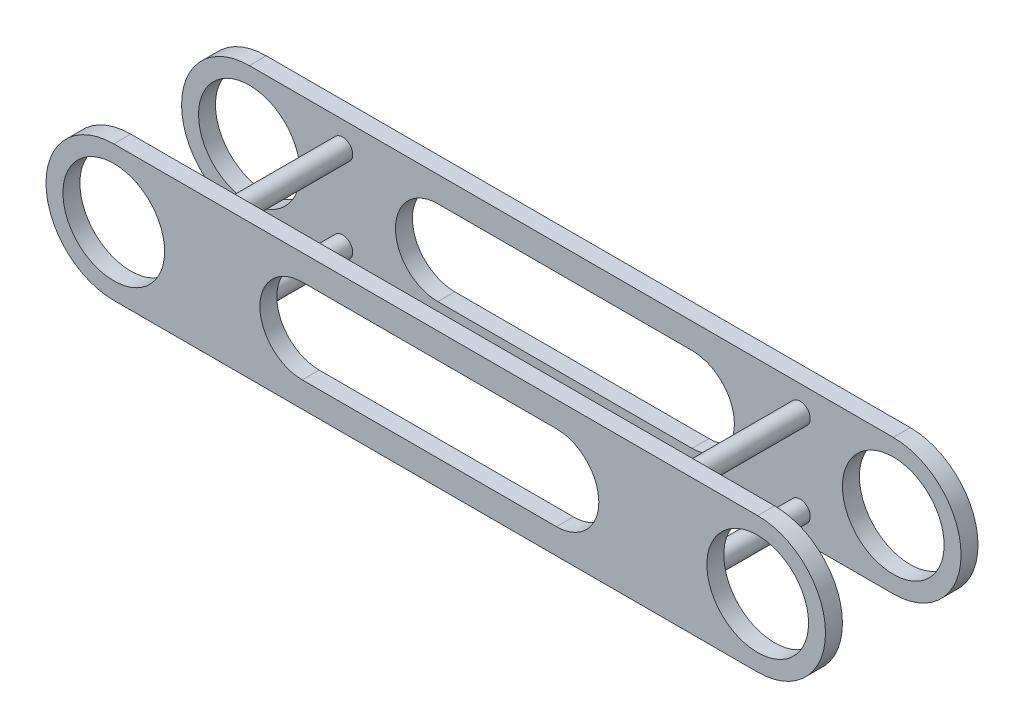
ISO-10303-21;
HEADER;
FILE_DESCRIPTION(('STEP AP214'),'2;1');
FILE_NAME('part.step','',(''),(''),'','','');
FILE_SCHEMA(('AUTOMOTIVE_DESIGN { 1 0 10303 214 1 1 1 1 }'));
ENDSEC;
DATA;
#1=APPLICATION_CONTEXT('core data for automotive mechanical design processes');
#2=APPLICATION_PROTOCOL_DEFINITION('international standard','automotive_design',2000,#1);
#3=PRODUCT_CONTEXT('',#1,'mechanical');
#4=PRODUCT('Part','Part','',(#3));
#5=PRODUCT_RELATED_PRODUCT_CATEGORY('part','',(#4));
#6=PRODUCT_DEFINITION_FORMATION('','',#4);
#7=PRODUCT_DEFINITION_CONTEXT('part definition',#1,'design');
#8=PRODUCT_DEFINITION('design','',#6,#7);
#9=PRODUCT_DEFINITION_SHAPE('','',#8);
#10=(LENGTH_UNIT() NAMED_UNIT(*) SI_UNIT(.MILLI.,.METRE.));
#11=(NAMED_UNIT(*) PLANE_ANGLE_UNIT() SI_UNIT($,.RADIAN.));
#12=(NAMED_UNIT(*) SI_UNIT($,.STERADIAN.) SOLID_ANGLE_UNIT());
#13=UNCERTAINTY_MEASURE_WITH_UNIT(LENGTH_MEASURE(1.E-05),#10,'distance_accuracy_value','');
#14=(GEOMETRIC_REPRESENTATION_CONTEXT(3) GLOBAL_UNCERTAINTY_ASSIGNED_CONTEXT((#13)) GLOBAL_UNIT_ASSIGNED_CONTEXT((#10,
#11,#12)) REPRESENTATION_CONTEXT('',''));
#15=CARTESIAN_POINT('',(0.,0.,0.));
#16=DIRECTION('',(0.,0.,1.));
#17=DIRECTION('',(1.,0.,0.));
#18=AXIS2_PLACEMENT_3D('',#15,#16,#17);
#19=CARTESIAN_POINT('',(380.,0.,-35.));
#20=DIRECTION('',(0.,0.,-1.));
#21=DIRECTION('',(1.,0.,0.));
#22=AXIS2_PLACEMENT_3D('',#19,#20,#21);
#23=PLANE('',#22);
#24=CARTESIAN_POINT('',(55.,25.,-35.));
#25=DIRECTION('',(0.,0.,-1.));
#26=DIRECTION('',(-1.,0.,0.));
#27=AXIS2_PLACEMENT_3D('',#24,#25,#26);
#28=CIRCLE('',#27,6.00000000000007);
#29=CARTESIAN_POINT('',(48.9999999999999,25.,-35.));
#30=VERTEX_POINT('',#29);
#31=EDGE_CURVE('E478',#30,#30,#28,.T.);
#32=ORIENTED_EDGE('',*,*,#31,.T.);
#33=EDGE_LOOP('',(#32));
#34=FACE_BOUND('',#33,.T.);
#35=CARTESIAN_POINT('',(55.,-25.,-35.));
#36=DIRECTION('',(0.,0.,-1.));
#37=DIRECTION('',(-1.,0.,0.));
#38=AXIS2_PLACEMENT_3D('',#35,#36,#37);
#39=CIRCLE('',#38,5.99999999999996);
#40=CARTESIAN_POINT('',(49.,-25.,-35.));
#41=VERTEX_POINT('',#40);
#42=EDGE_CURVE('E472',#41,#41,#39,.T.);
#43=ORIENTED_EDGE('',*,*,#42,.T.);
#44=EDGE_LOOP('',(#43));
#45=FACE_BOUND('',#44,.T.);
#46=CARTESIAN_POINT('',(325.,-25.,-35.));
#47=DIRECTION('',(0.,0.,-1.));
#48=DIRECTION('',(-1.,0.,0.));
#49=AXIS2_PLACEMENT_3D('',#46,#47,#48);
#50=CIRCLE('',#49,5.99999999999999);
#51=CARTESIAN_POINT('',(319.,-25.,-35.));
#52=VERTEX_POINT('',#51);
#53=EDGE_CURVE('E468',#52,#52,#50,.T.);
#54=ORIENTED_EDGE('',*,*,#53,.T.);
#55=EDGE_LOOP('',(#54));
#56=FACE_BOUND('',#55,.T.);
#57=CARTESIAN_POINT('',(325.,25.,-35.));
#58=DIRECTION('',(0.,0.,-1.));
#59=DIRECTION('',(-1.,0.,0.));
#60=AXIS2_PLACEMENT_3D('',#57,#58,#59);
#61=CIRCLE('',#60,5.99999999999999);
#62=CARTESIAN_POINT('',(319.,25.,-35.));
#63=VERTEX_POINT('',#62);
#64=EDGE_CURVE('E464',#63,#63,#61,.T.);
#65=ORIENTED_EDGE('',*,*,#64,.T.);
#66=EDGE_LOOP('',(#65));
#67=FACE_BOUND('',#66,.T.);
#68=CARTESIAN_POINT('',(380.,0.,-35.));
#69=DIRECTION('',(0.,0.,1.));
#70=DIRECTION('',(1.,0.,0.));
#71=AXIS2_PLACEMENT_3D('',#68,#69,#70);
#72=CIRCLE('',#71,40.);
#73=CARTESIAN_POINT('',(380.,-40.,-35.));
#74=VERTEX_POINT('',#73);
#75=CARTESIAN_POINT('',(380.,40.,-35.));
#76=VERTEX_POINT('',#75);
#77=EDGE_CURVE('E206',#74,#76,#72,.T.);
#78=ORIENTED_EDGE('',*,*,#77,.T.);
#79=DIRECTION('',(-1.,0.,0.));
#80=VECTOR('',#79,1.);
#81=CARTESIAN_POINT('',(0.,40.,-35.));
#82=LINE('',#81,#80);
#83=CARTESIAN_POINT('',(0.,40.,-35.));
#84=VERTEX_POINT('',#83);
#85=EDGE_CURVE('E220',#76,#84,#82,.T.);
#86=ORIENTED_EDGE('',*,*,#85,.T.);
#87=CARTESIAN_POINT('',(0.,0.,-35.));
#88=DIRECTION('',(0.,0.,1.));
#89=DIRECTION('',(1.,0.,0.));
#90=AXIS2_PLACEMENT_3D('',#87,#88,#89);
#91=CIRCLE('',#90,40.);
#92=CARTESIAN_POINT('',(0.,-40.,-35.));
#93=VERTEX_POINT('',#92);
#94=EDGE_CURVE('E212',#84,#93,#91,.T.);
#95=ORIENTED_EDGE('',*,*,#94,.T.);
#96=DIRECTION('',(1.,0.,0.));
#97=VECTOR('',#96,1.);
#98=CARTESIAN_POINT('',(0.,-40.,-35.));
#99=LINE('',#98,#97);
#100=EDGE_CURVE('E209',#93,#74,#99,.T.);
#101=ORIENTED_EDGE('',*,*,#100,.T.);
#102=EDGE_LOOP('',(#78,#86,#95,#101));
#103=FACE_BOUND('',#102,.T.);
#104=CARTESIAN_POINT('',(380.,0.,-35.));
#105=DIRECTION('',(0.,0.,-1.));
#106=DIRECTION('',(-1.,0.,0.));
#107=AXIS2_PLACEMENT_3D('',#104,#105,#106);
#108=CIRCLE('',#107,30.);
#109=CARTESIAN_POINT('',(350.,0.,-35.));
#110=VERTEX_POINT('',#109);
#111=EDGE_CURVE('E441',#110,#110,#108,.T.);
#112=ORIENTED_EDGE('',*,*,#111,.T.);
#113=EDGE_LOOP('',(#112));
#114=FACE_BOUND('',#113,.T.);
#115=CARTESIAN_POINT('',(0.,0.,-35.));
#116=DIRECTION('',(0.,0.,-1.));
#117=DIRECTION('',(-1.,0.,0.));
#118=AXIS2_PLACEMENT_3D('',#115,#116,#117);
#119=CIRCLE('',#118,30.);
#120=CARTESIAN_POINT('',(-30.,0.,-35.));
#121=VERTEX_POINT('',#120);
#122=EDGE_CURVE('E429',#121,#121,#119,.T.);
#123=ORIENTED_EDGE('',*,*,#122,.T.);
#124=EDGE_LOOP('',(#123));
#125=FACE_BOUND('',#124,.T.);
#126=CARTESIAN_POINT('',(111.23235506103,0.,-35.));
#127=DIRECTION('',(0.,0.,-1.));
#128=DIRECTION('',(-1.,0.,0.));
#129=AXIS2_PLACEMENT_3D('',#126,#127,#128);
#130=CIRCLE('',#129,25.);
#131=CARTESIAN_POINT('',(111.23235506103,25.,-35.));
#132=VERTEX_POINT('',#131);
#133=CARTESIAN_POINT('',(111.23235506103,-25.,-35.));
#134=VERTEX_POINT('',#133);
#135=EDGE_CURVE('E205',#132,#134,#130,.F.);
#136=ORIENTED_EDGE('',*,*,#135,.F.);
#137=DIRECTION('',(-1.,0.,0.));
#138=VECTOR('',#137,1.);
#139=CARTESIAN_POINT('',(380.,25.,-35.));
#140=LINE('',#139,#138);
#141=CARTESIAN_POINT('',(261.23235506103,25.,-35.));
#142=VERTEX_POINT('',#141);
#143=EDGE_CURVE('E187',#142,#132,#140,.T.);
#144=ORIENTED_EDGE('',*,*,#143,.F.);
#145=CARTESIAN_POINT('',(261.23235506103,0.,-35.));
#146=DIRECTION('',(0.,0.,-1.));
#147=DIRECTION('',(-1.,0.,0.));
#148=AXIS2_PLACEMENT_3D('',#145,#146,#147);
#149=CIRCLE('',#148,25.);
#150=CARTESIAN_POINT('',(261.23235506103,-25.,-35.));
#151=VERTEX_POINT('',#150);
#152=EDGE_CURVE('E167',#151,#142,#149,.F.);
#153=ORIENTED_EDGE('',*,*,#152,.F.);
#154=DIRECTION('',(1.,0.,0.));
#155=VECTOR('',#154,1.);
#156=CARTESIAN_POINT('',(380.,-25.,-35.));
#157=LINE('',#156,#155);
#158=EDGE_CURVE('E200',#134,#151,#157,.T.);
#159=ORIENTED_EDGE('',*,*,#158,.F.);
#160=EDGE_LOOP('',(#136,#144,#153,#159));
#161=FACE_BOUND('',#160,.T.);
#162=ADVANCED_FACE('F44',(#34,#45,#56,#67,#103,#114,#125,#161),#23,.F.);
#163=CARTESIAN_POINT('',(380.,0.,-45.));
#164=DIRECTION('',(0.,0.,-1.));
#165=DIRECTION('',(1.,0.,0.));
#166=AXIS2_PLACEMENT_3D('',#163,#164,#165);
#167=PLANE('',#166);
#168=CARTESIAN_POINT('',(0.,0.,-45.));
#169=DIRECTION('',(0.,0.,-1.));
#170=DIRECTION('',(-1.,0.,0.));
#171=AXIS2_PLACEMENT_3D('',#168,#169,#170);
#172=CIRCLE('',#171,30.);
#173=CARTESIAN_POINT('',(-30.,0.,-45.));
#174=VERTEX_POINT('',#173);
#175=EDGE_CURVE('E424',#174,#174,#172,.T.);
#176=ORIENTED_EDGE('',*,*,#175,.F.);
#177=EDGE_LOOP('',(#176));
#178=FACE_BOUND('',#177,.T.);
#179=CARTESIAN_POINT('',(380.,0.,-45.));
#180=DIRECTION('',(0.,0.,-1.));
#181=DIRECTION('',(-1.,0.,0.));
#182=AXIS2_PLACEMENT_3D('',#179,#180,#181);
#183=CIRCLE('',#182,30.);
#184=CARTESIAN_POINT('',(350.,0.,-45.));
#185=VERTEX_POINT('',#184);
#186=EDGE_CURVE('E439',#185,#185,#183,.T.);
#187=ORIENTED_EDGE('',*,*,#186,.F.);
#188=EDGE_LOOP('',(#187));
#189=FACE_BOUND('',#188,.T.);
#190=CARTESIAN_POINT('',(380.,0.,-45.));
#191=DIRECTION('',(0.,0.,1.));
#192=DIRECTION('',(1.,0.,0.));
#193=AXIS2_PLACEMENT_3D('',#190,#191,#192);
#194=CIRCLE('',#193,40.);
#195=CARTESIAN_POINT('',(380.,-40.,-45.));
#196=VERTEX_POINT('',#195);
#197=CARTESIAN_POINT('',(380.,40.,-45.));
#198=VERTEX_POINT('',#197);
#199=EDGE_CURVE('E202',#196,#198,#194,.T.);
#200=ORIENTED_EDGE('',*,*,#199,.F.);
#201=DIRECTION('',(1.,0.,0.));
#202=VECTOR('',#201,1.);
#203=CARTESIAN_POINT('',(0.,-40.,-45.));
#204=LINE('',#203,#202);
#205=CARTESIAN_POINT('',(0.,-40.,-45.));
#206=VERTEX_POINT('',#205);
#207=EDGE_CURVE('E221',#206,#196,#204,.T.);
#208=ORIENTED_EDGE('',*,*,#207,.F.);
#209=CARTESIAN_POINT('',(0.,0.,-45.));
#210=DIRECTION('',(0.,0.,1.));
#211=DIRECTION('',(1.,0.,0.));
#212=AXIS2_PLACEMENT_3D('',#209,#210,#211);
#213=CIRCLE('',#212,40.);
#214=CARTESIAN_POINT('',(0.,40.,-45.));
#215=VERTEX_POINT('',#214);
#216=EDGE_CURVE('E230',#215,#206,#213,.T.);
#217=ORIENTED_EDGE('',*,*,#216,.F.);
#218=DIRECTION('',(-1.,0.,0.));
#219=VECTOR('',#218,1.);
#220=CARTESIAN_POINT('',(0.,40.,-45.));
#221=LINE('',#220,#219);
#222=EDGE_CURVE('E211',#198,#215,#221,.T.);
#223=ORIENTED_EDGE('',*,*,#222,.F.);
#224=EDGE_LOOP('',(#200,#208,#217,#223));
#225=FACE_BOUND('',#224,.T.);
#226=DIRECTION('',(-1.,0.,0.));
#227=VECTOR('',#226,1.);
#228=CARTESIAN_POINT('',(111.23235506103,25.,-45.));
#229=LINE('',#228,#227);
#230=CARTESIAN_POINT('',(261.23235506103,25.,-45.));
#231=VERTEX_POINT('',#230);
#232=CARTESIAN_POINT('',(111.23235506103,25.,-45.));
#233=VERTEX_POINT('',#232);
#234=EDGE_CURVE('E171',#231,#233,#229,.T.);
#235=ORIENTED_EDGE('',*,*,#234,.T.);
#236=CARTESIAN_POINT('',(111.23235506103,0.,-45.));
#237=DIRECTION('',(0.,0.,1.));
#238=DIRECTION('',(1.,0.,0.));
#239=AXIS2_PLACEMENT_3D('',#236,#237,#238);
#240=CIRCLE('',#239,25.);
#241=CARTESIAN_POINT('',(111.23235506103,-25.,-45.));
#242=VERTEX_POINT('',#241);
#243=EDGE_CURVE('E72',#233,#242,#240,.T.);
#244=ORIENTED_EDGE('',*,*,#243,.T.);
#245=DIRECTION('',(1.,0.,0.));
#246=VECTOR('',#245,1.);
#247=CARTESIAN_POINT('',(111.23235506103,-25.,-45.));
#248=LINE('',#247,#246);
#249=CARTESIAN_POINT('',(261.23235506103,-25.,-45.));
#250=VERTEX_POINT('',#249);
#251=EDGE_CURVE('E179',#242,#250,#248,.T.);
#252=ORIENTED_EDGE('',*,*,#251,.T.);
#253=CARTESIAN_POINT('',(261.23235506103,0.,-45.));
#254=DIRECTION('',(0.,0.,1.));
#255=DIRECTION('',(1.,0.,0.));
#256=AXIS2_PLACEMENT_3D('',#253,#254,#255);
#257=CIRCLE('',#256,25.);
#258=EDGE_CURVE('E162',#250,#231,#257,.T.);
#259=ORIENTED_EDGE('',*,*,#258,.T.);
#260=EDGE_LOOP('',(#235,#244,#252,#259));
#261=FACE_BOUND('',#260,.T.);
#262=ADVANCED_FACE('F178',(#178,#189,#225,#261),#167,.T.);
#263=CARTESIAN_POINT('',(380.,0.,35.));
#264=DIRECTION('',(0.,0.,1.));
#265=DIRECTION('',(1.,0.,0.));
#266=AXIS2_PLACEMENT_3D('',#263,#264,#265);
#267=CYLINDRICAL_SURFACE('',#266,40.);
#268=CARTESIAN_POINT('',(380.,0.,45.));
#269=DIRECTION('',(0.,0.,1.));
#270=DIRECTION('',(1.,0.,0.));
#271=AXIS2_PLACEMENT_3D('',#268,#269,#270);
#272=CIRCLE('',#271,40.);
#273=CARTESIAN_POINT('',(380.,-40.,45.));
#274=VERTEX_POINT('',#273);
#275=CARTESIAN_POINT('',(380.,40.,45.));
#276=VERTEX_POINT('',#275);
#277=EDGE_CURVE('E292',#274,#276,#272,.T.);
#278=ORIENTED_EDGE('',*,*,#277,.F.);
#279=DIRECTION('',(0.,0.,1.));
#280=VECTOR('',#279,1.);
#281=CARTESIAN_POINT('',(380.,-40.,35.));
#282=LINE('',#281,#280);
#283=CARTESIAN_POINT('',(380.,-40.,35.));
#284=VERTEX_POINT('',#283);
#285=EDGE_CURVE('E11',#284,#274,#282,.T.);
#286=ORIENTED_EDGE('',*,*,#285,.F.);
#287=CARTESIAN_POINT('',(380.,0.,35.));
#288=DIRECTION('',(0.,0.,1.));
#289=DIRECTION('',(1.,0.,0.));
#290=AXIS2_PLACEMENT_3D('',#287,#288,#289);
#291=CIRCLE('',#290,40.);
#292=CARTESIAN_POINT('',(380.,40.,35.));
#293=VERTEX_POINT('',#292);
#294=EDGE_CURVE('E295',#284,#293,#291,.T.);
#295=ORIENTED_EDGE('',*,*,#294,.T.);
#296=DIRECTION('',(0.,0.,1.));
#297=VECTOR('',#296,1.);
#298=CARTESIAN_POINT('',(380.,40.,35.));
#299=LINE('',#298,#297);
#300=EDGE_CURVE('E47',#293,#276,#299,.T.);
#301=ORIENTED_EDGE('',*,*,#300,.T.);
#302=EDGE_LOOP('',(#278,#286,#295,#301));
#303=FACE_BOUND('',#302,.T.);
#304=ADVANCED_FACE('F50',(#303),#267,.T.);
#305=CARTESIAN_POINT('',(0.,-40.,35.));
#306=DIRECTION('',(0.,-1.,0.));
#307=DIRECTION('',(1.,0.,0.));
#308=AXIS2_PLACEMENT_3D('',#305,#306,#307);
#309=PLANE('',#308);
#310=DIRECTION('',(1.,0.,0.));
#311=VECTOR('',#310,1.);
#312=CARTESIAN_POINT('',(0.,-40.,45.));
#313=LINE('',#312,#311);
#314=CARTESIAN_POINT('',(0.,-40.,45.));
#315=VERTEX_POINT('',#314);
#316=EDGE_CURVE('E300',#315,#274,#313,.T.);
#317=ORIENTED_EDGE('',*,*,#316,.F.);
#318=DIRECTION('',(0.,0.,1.));
#319=VECTOR('',#318,1.);
#320=CARTESIAN_POINT('',(0.,-40.,35.));
#321=LINE('',#320,#319);
#322=CARTESIAN_POINT('',(0.,-40.,35.));
#323=VERTEX_POINT('',#322);
#324=EDGE_CURVE('E54',#323,#315,#321,.T.);
#325=ORIENTED_EDGE('',*,*,#324,.F.);
#326=DIRECTION('',(1.,0.,0.));
#327=VECTOR('',#326,1.);
#328=CARTESIAN_POINT('',(0.,-40.,35.));
#329=LINE('',#328,#327);
#330=EDGE_CURVE('E304',#323,#284,#329,.T.);
#331=ORIENTED_EDGE('',*,*,#330,.T.);
#332=ORIENTED_EDGE('',*,*,#285,.T.);
#333=EDGE_LOOP('',(#317,#325,#331,#332));
#334=FACE_BOUND('',#333,.T.);
#335=ADVANCED_FACE('F339',(#334),#309,.T.);
#336=CARTESIAN_POINT('',(0.,0.,35.));
#337=DIRECTION('',(0.,0.,1.));
#338=DIRECTION('',(1.,0.,0.));
#339=AXIS2_PLACEMENT_3D('',#336,#337,#338);
#340=CYLINDRICAL_SURFACE('',#339,40.);
#341=CARTESIAN_POINT('',(0.,0.,45.));
#342=DIRECTION('',(0.,0.,1.));
#343=DIRECTION('',(1.,0.,0.));
#344=AXIS2_PLACEMENT_3D('',#341,#342,#343);
#345=CIRCLE('',#344,40.);
#346=CARTESIAN_POINT('',(0.,40.,45.));
#347=VERTEX_POINT('',#346);
#348=EDGE_CURVE('E316',#347,#315,#345,.T.);
#349=ORIENTED_EDGE('',*,*,#348,.F.);
#350=DIRECTION('',(0.,0.,1.));
#351=VECTOR('',#350,1.);
#352=CARTESIAN_POINT('',(0.,40.,35.));
#353=LINE('',#352,#351);
#354=CARTESIAN_POINT('',(0.,40.,35.));
#355=VERTEX_POINT('',#354);
#356=EDGE_CURVE('E322',#355,#347,#353,.T.);
#357=ORIENTED_EDGE('',*,*,#356,.F.);
#358=CARTESIAN_POINT('',(0.,0.,35.));
#359=DIRECTION('',(0.,0.,1.));
#360=DIRECTION('',(1.,0.,0.));
#361=AXIS2_PLACEMENT_3D('',#358,#359,#360);
#362=CIRCLE('',#361,40.);
#363=EDGE_CURVE('E301',#355,#323,#362,.T.);
#364=ORIENTED_EDGE('',*,*,#363,.T.);
#365=ORIENTED_EDGE('',*,*,#324,.T.);
#366=EDGE_LOOP('',(#349,#357,#364,#365));
#367=FACE_BOUND('',#366,.T.);
#368=ADVANCED_FACE('F344',(#367),#340,.T.);
#369=CARTESIAN_POINT('',(0.,40.,35.));
#370=DIRECTION('',(0.,1.,0.));
#371=DIRECTION('',(0.,0.,1.));
#372=AXIS2_PLACEMENT_3D('',#369,#370,#371);
#373=PLANE('',#372);
#374=DIRECTION('',(-1.,0.,0.));
#375=VECTOR('',#374,1.);
#376=CARTESIAN_POINT('',(0.,40.,45.));
#377=LINE('',#376,#375);
#378=EDGE_CURVE('E315',#276,#347,#377,.T.);
#379=ORIENTED_EDGE('',*,*,#378,.F.);
#380=ORIENTED_EDGE('',*,*,#300,.F.);
#381=DIRECTION('',(-1.,0.,0.));
#382=VECTOR('',#381,1.);
#383=CARTESIAN_POINT('',(0.,40.,35.));
#384=LINE('',#383,#382);
#385=EDGE_CURVE('E298',#293,#355,#384,.T.);
#386=ORIENTED_EDGE('',*,*,#385,.T.);
#387=ORIENTED_EDGE('',*,*,#356,.T.);
#388=EDGE_LOOP('',(#379,#380,#386,#387));
#389=FACE_BOUND('',#388,.T.);
#390=ADVANCED_FACE('F331',(#389),#373,.T.);
#391=CARTESIAN_POINT('',(380.,0.,35.));
#392=DIRECTION('',(0.,0.,1.));
#393=DIRECTION('',(1.,0.,0.));
#394=AXIS2_PLACEMENT_3D('',#391,#392,#393);
#395=PLANE('',#394);
#396=CARTESIAN_POINT('',(55.,25.,35.));
#397=DIRECTION('',(0.,0.,1.));
#398=DIRECTION('',(1.,0.,0.));
#399=AXIS2_PLACEMENT_3D('',#396,#397,#398);
#400=CIRCLE('',#399,6.00000000000007);
#401=CARTESIAN_POINT('',(61.,25.,35.));
#402=VERTEX_POINT('',#401);
#403=EDGE_CURVE('E446',#402,#402,#400,.F.);
#404=ORIENTED_EDGE('',*,*,#403,.F.);
#405=EDGE_LOOP('',(#404));
#406=FACE_BOUND('',#405,.T.);
#407=CARTESIAN_POINT('',(55.,-25.,35.));
#408=DIRECTION('',(0.,0.,1.));
#409=DIRECTION('',(1.,0.,0.));
#410=AXIS2_PLACEMENT_3D('',#407,#408,#409);
#411=CIRCLE('',#410,5.99999999999996);
#412=CARTESIAN_POINT('',(60.9999999999999,-25.,35.));
#413=VERTEX_POINT('',#412);
#414=EDGE_CURVE('E452',#413,#413,#411,.F.);
#415=ORIENTED_EDGE('',*,*,#414,.F.);
#416=EDGE_LOOP('',(#415));
#417=FACE_BOUND('',#416,.T.);
#418=CARTESIAN_POINT('',(325.,-25.,35.));
#419=DIRECTION('',(0.,0.,1.));
#420=DIRECTION('',(1.,0.,0.));
#421=AXIS2_PLACEMENT_3D('',#418,#419,#420);
#422=CIRCLE('',#421,5.99999999999999);
#423=CARTESIAN_POINT('',(331.,-25.,35.));
#424=VERTEX_POINT('',#423);
#425=EDGE_CURVE('E449',#424,#424,#422,.F.);
#426=ORIENTED_EDGE('',*,*,#425,.F.);
#427=EDGE_LOOP('',(#426));
#428=FACE_BOUND('',#427,.T.);
#429=CARTESIAN_POINT('',(325.,25.,35.));
#430=DIRECTION('',(0.,0.,1.));
#431=DIRECTION('',(1.,0.,0.));
#432=AXIS2_PLACEMENT_3D('',#429,#430,#431);
#433=CIRCLE('',#432,5.99999999999999);
#434=CARTESIAN_POINT('',(331.,25.,35.));
#435=VERTEX_POINT('',#434);
#436=EDGE_CURVE('E453',#435,#435,#433,.F.);
#437=ORIENTED_EDGE('',*,*,#436,.F.);
#438=EDGE_LOOP('',(#437));
#439=FACE_BOUND('',#438,.T.);
#440=CARTESIAN_POINT('',(380.,0.,35.));
#441=DIRECTION('',(0.,0.,1.));
#442=DIRECTION('',(1.,0.,0.));
#443=AXIS2_PLACEMENT_3D('',#440,#441,#442);
#444=CIRCLE('',#443,30.);
#445=CARTESIAN_POINT('',(410.,0.,35.));
#446=VERTEX_POINT('',#445);
#447=EDGE_CURVE('E436',#446,#446,#444,.T.);
#448=ORIENTED_EDGE('',*,*,#447,.T.);
#449=EDGE_LOOP('',(#448));
#450=FACE_BOUND('',#449,.T.);
#451=DIRECTION('',(-1.,0.,0.));
#452=VECTOR('',#451,1.);
#453=CARTESIAN_POINT('',(380.,25.,35.));
#454=LINE('',#453,#452);
#455=CARTESIAN_POINT('',(261.23235506103,25.,35.));
#456=VERTEX_POINT('',#455);
#457=CARTESIAN_POINT('',(111.23235506103,25.,35.));
#458=VERTEX_POINT('',#457);
#459=EDGE_CURVE('E281',#456,#458,#454,.T.);
#460=ORIENTED_EDGE('',*,*,#459,.T.);
#461=CARTESIAN_POINT('',(111.23235506103,0.,35.));
#462=DIRECTION('',(0.,0.,1.));
#463=DIRECTION('',(1.,0.,0.));
#464=AXIS2_PLACEMENT_3D('',#461,#462,#463);
#465=CIRCLE('',#464,25.);
#466=CARTESIAN_POINT('',(111.23235506103,-25.,35.));
#467=VERTEX_POINT('',#466);
#468=EDGE_CURVE('E290',#458,#467,#465,.T.);
#469=ORIENTED_EDGE('',*,*,#468,.T.);
#470=DIRECTION('',(1.,0.,0.));
#471=VECTOR('',#470,1.);
#472=CARTESIAN_POINT('',(380.,-25.,35.));
#473=LINE('',#472,#471);
#474=CARTESIAN_POINT('',(261.23235506103,-25.,35.));
#475=VERTEX_POINT('',#474);
#476=EDGE_CURVE('E266',#467,#475,#473,.T.);
#477=ORIENTED_EDGE('',*,*,#476,.T.);
#478=CARTESIAN_POINT('',(261.23235506103,0.,35.));
#479=DIRECTION('',(0.,0.,1.));
#480=DIRECTION('',(1.,0.,0.));
#481=AXIS2_PLACEMENT_3D('',#478,#479,#480);
#482=CIRCLE('',#481,25.);
#483=EDGE_CURVE('E276',#475,#456,#482,.T.);
#484=ORIENTED_EDGE('',*,*,#483,.T.);
#485=EDGE_LOOP('',(#460,#469,#477,#484));
#486=FACE_BOUND('',#485,.T.);
#487=CARTESIAN_POINT('',(0.,0.,35.));
#488=DIRECTION('',(0.,0.,1.));
#489=DIRECTION('',(1.,0.,0.));
#490=AXIS2_PLACEMENT_3D('',#487,#488,#489);
#491=CIRCLE('',#490,30.);
#492=CARTESIAN_POINT('',(30.,0.,35.));
#493=VERTEX_POINT('',#492);
#494=EDGE_CURVE('E419',#493,#493,#491,.T.);
#495=ORIENTED_EDGE('',*,*,#494,.T.);
#496=EDGE_LOOP('',(#495));
#497=FACE_BOUND('',#496,.T.);
#498=ORIENTED_EDGE('',*,*,#294,.F.);
#499=ORIENTED_EDGE('',*,*,#330,.F.);
#500=ORIENTED_EDGE('',*,*,#363,.F.);
#501=ORIENTED_EDGE('',*,*,#385,.F.);
#502=EDGE_LOOP('',(#498,#499,#500,#501));
#503=FACE_BOUND('',#502,.T.);
#504=ADVANCED_FACE('F345',(#406,#417,#428,#439,#450,#486,#497,#503),#395,.F.);
#505=CARTESIAN_POINT('',(380.,0.,45.));
#506=DIRECTION('',(0.,0.,1.));
#507=DIRECTION('',(1.,0.,0.));
#508=AXIS2_PLACEMENT_3D('',#505,#506,#507);
#509=PLANE('',#508);
#510=CARTESIAN_POINT('',(380.,0.,45.));
#511=DIRECTION('',(0.,0.,1.));
#512=DIRECTION('',(1.,0.,0.));
#513=AXIS2_PLACEMENT_3D('',#510,#511,#512);
#514=CIRCLE('',#513,30.);
#515=CARTESIAN_POINT('',(410.,0.,45.));
#516=VERTEX_POINT('',#515);
#517=EDGE_CURVE('E407',#516,#516,#514,.T.);
#518=ORIENTED_EDGE('',*,*,#517,.F.);
#519=EDGE_LOOP('',(#518));
#520=FACE_BOUND('',#519,.T.);
#521=CARTESIAN_POINT('',(111.23235506103,0.,45.));
#522=DIRECTION('',(0.,0.,1.));
#523=DIRECTION('',(1.,0.,0.));
#524=AXIS2_PLACEMENT_3D('',#521,#522,#523);
#525=CIRCLE('',#524,25.);
#526=CARTESIAN_POINT('',(111.23235506103,25.,45.));
#527=VERTEX_POINT('',#526);
#528=CARTESIAN_POINT('',(111.23235506103,-25.,45.));
#529=VERTEX_POINT('',#528);
#530=EDGE_CURVE('E237',#527,#529,#525,.T.);
#531=ORIENTED_EDGE('',*,*,#530,.F.);
#532=DIRECTION('',(-1.,0.,0.));
#533=VECTOR('',#532,1.);
#534=CARTESIAN_POINT('',(111.23235506103,25.,45.));
#535=LINE('',#534,#533);
#536=CARTESIAN_POINT('',(261.23235506103,25.,45.));
#537=VERTEX_POINT('',#536);
#538=EDGE_CURVE('E256',#537,#527,#535,.T.);
#539=ORIENTED_EDGE('',*,*,#538,.F.);
#540=CARTESIAN_POINT('',(261.23235506103,0.,45.));
#541=DIRECTION('',(0.,0.,1.));
#542=DIRECTION('',(1.,0.,0.));
#543=AXIS2_PLACEMENT_3D('',#540,#541,#542);
#544=CIRCLE('',#543,25.);
#545=CARTESIAN_POINT('',(261.23235506103,-25.,45.));
#546=VERTEX_POINT('',#545);
#547=EDGE_CURVE('E255',#546,#537,#544,.T.);
#548=ORIENTED_EDGE('',*,*,#547,.F.);
#549=DIRECTION('',(1.,0.,0.));
#550=VECTOR('',#549,1.);
#551=CARTESIAN_POINT('',(111.23235506103,-25.,45.));
#552=LINE('',#551,#550);
#553=EDGE_CURVE('E249',#529,#546,#552,.T.);
#554=ORIENTED_EDGE('',*,*,#553,.F.);
#555=EDGE_LOOP('',(#531,#539,#548,#554));
#556=FACE_BOUND('',#555,.T.);
#557=CARTESIAN_POINT('',(0.,0.,45.));
#558=DIRECTION('',(0.,0.,1.));
#559=DIRECTION('',(1.,0.,0.));
#560=AXIS2_PLACEMENT_3D('',#557,#558,#559);
#561=CIRCLE('',#560,30.);
#562=CARTESIAN_POINT('',(30.,0.,45.));
#563=VERTEX_POINT('',#562);
#564=EDGE_CURVE('E417',#563,#563,#561,.T.);
#565=ORIENTED_EDGE('',*,*,#564,.F.);
#566=EDGE_LOOP('',(#565));
#567=FACE_BOUND('',#566,.T.);
#568=ORIENTED_EDGE('',*,*,#277,.T.);
#569=ORIENTED_EDGE('',*,*,#378,.T.);
#570=ORIENTED_EDGE('',*,*,#348,.T.);
#571=ORIENTED_EDGE('',*,*,#316,.T.);
#572=EDGE_LOOP('',(#568,#569,#570,#571));
#573=FACE_BOUND('',#572,.T.);
#574=ADVANCED_FACE('F338',(#520,#556,#567,#573),#509,.T.);
#575=CARTESIAN_POINT('',(111.23235506103,0.,-52.5));
#576=DIRECTION('',(0.,0.,1.));
#577=DIRECTION('',(1.,0.,0.));
#578=AXIS2_PLACEMENT_3D('',#575,#576,#577);
#579=CYLINDRICAL_SURFACE('',#578,25.);
#580=DIRECTION('',(0.,0.,1.));
#581=VECTOR('',#580,1.);
#582=CARTESIAN_POINT('',(111.23235506103,25.,-52.5));
#583=LINE('',#582,#581);
#584=EDGE_CURVE('E263',#458,#527,#583,.T.);
#585=ORIENTED_EDGE('',*,*,#584,.T.);
#586=ORIENTED_EDGE('',*,*,#530,.T.);
#587=DIRECTION('',(0.,0.,1.));
#588=VECTOR('',#587,1.);
#589=CARTESIAN_POINT('',(111.23235506103,-25.,-52.5));
#590=LINE('',#589,#588);
#591=EDGE_CURVE('E265',#467,#529,#590,.T.);
#592=ORIENTED_EDGE('',*,*,#591,.F.);
#593=ORIENTED_EDGE('',*,*,#468,.F.);
#594=EDGE_LOOP('',(#585,#586,#592,#593));
#595=FACE_BOUND('',#594,.T.);
#596=ADVANCED_FACE('F386',(#595),#579,.F.);
#597=CARTESIAN_POINT('',(111.23235506103,25.,-52.5));
#598=DIRECTION('',(0.,1.,0.));
#599=DIRECTION('',(0.,0.,1.));
#600=AXIS2_PLACEMENT_3D('',#597,#598,#599);
#601=PLANE('',#600);
#602=DIRECTION('',(0.,0.,1.));
#603=VECTOR('',#602,1.);
#604=CARTESIAN_POINT('',(261.23235506103,25.,-52.5));
#605=LINE('',#604,#603);
#606=EDGE_CURVE('E270',#456,#537,#605,.T.);
#607=ORIENTED_EDGE('',*,*,#606,.T.);
#608=ORIENTED_EDGE('',*,*,#538,.T.);
#609=ORIENTED_EDGE('',*,*,#584,.F.);
#610=ORIENTED_EDGE('',*,*,#459,.F.);
#611=EDGE_LOOP('',(#607,#608,#609,#610));
#612=FACE_BOUND('',#611,.T.);
#613=ADVANCED_FACE('F384',(#612),#601,.F.);
#614=CARTESIAN_POINT('',(261.23235506103,0.,-52.5));
#615=DIRECTION('',(0.,0.,1.));
#616=DIRECTION('',(1.,0.,0.));
#617=AXIS2_PLACEMENT_3D('',#614,#615,#616);
#618=CYLINDRICAL_SURFACE('',#617,25.);
#619=DIRECTION('',(0.,0.,1.));
#620=VECTOR('',#619,1.);
#621=CARTESIAN_POINT('',(261.23235506103,-25.,-52.5));
#622=LINE('',#621,#620);
#623=EDGE_CURVE('E269',#475,#546,#622,.T.);
#624=ORIENTED_EDGE('',*,*,#623,.T.);
#625=ORIENTED_EDGE('',*,*,#547,.T.);
#626=ORIENTED_EDGE('',*,*,#606,.F.);
#627=ORIENTED_EDGE('',*,*,#483,.F.);
#628=EDGE_LOOP('',(#624,#625,#626,#627));
#629=FACE_BOUND('',#628,.T.);
#630=ADVANCED_FACE('F389',(#629),#618,.F.);
#631=CARTESIAN_POINT('',(111.23235506103,-25.,-52.5));
#632=DIRECTION('',(0.,-1.,0.));
#633=DIRECTION('',(0.,0.,-1.));
#634=AXIS2_PLACEMENT_3D('',#631,#632,#633);
#635=PLANE('',#634);
#636=ORIENTED_EDGE('',*,*,#591,.T.);
#637=ORIENTED_EDGE('',*,*,#553,.T.);
#638=ORIENTED_EDGE('',*,*,#623,.F.);
#639=ORIENTED_EDGE('',*,*,#476,.F.);
#640=EDGE_LOOP('',(#636,#637,#638,#639));
#641=FACE_BOUND('',#640,.T.);
#642=ADVANCED_FACE('F382',(#641),#635,.F.);
#643=CARTESIAN_POINT('',(380.,0.,-35.));
#644=DIRECTION('',(0.,0.,-1.));
#645=DIRECTION('',(-1.,0.,0.));
#646=AXIS2_PLACEMENT_3D('',#643,#644,#645);
#647=CYLINDRICAL_SURFACE('',#646,40.);
#648=ORIENTED_EDGE('',*,*,#199,.T.);
#649=DIRECTION('',(0.,0.,-1.));
#650=VECTOR('',#649,1.);
#651=CARTESIAN_POINT('',(380.,40.,-35.));
#652=LINE('',#651,#650);
#653=EDGE_CURVE('E235',#76,#198,#652,.T.);
#654=ORIENTED_EDGE('',*,*,#653,.F.);
#655=ORIENTED_EDGE('',*,*,#77,.F.);
#656=DIRECTION('',(0.,0.,-1.));
#657=VECTOR('',#656,1.);
#658=CARTESIAN_POINT('',(380.,-40.,-35.));
#659=LINE('',#658,#657);
#660=EDGE_CURVE('E219',#74,#196,#659,.T.);
#661=ORIENTED_EDGE('',*,*,#660,.T.);
#662=EDGE_LOOP('',(#648,#654,#655,#661));
#663=FACE_BOUND('',#662,.T.);
#664=ADVANCED_FACE('F375',(#663),#647,.T.);
#665=CARTESIAN_POINT('',(0.,40.,-35.));
#666=DIRECTION('',(0.,-1.,0.));
#667=DIRECTION('',(0.,0.,-1.));
#668=AXIS2_PLACEMENT_3D('',#665,#666,#667);
#669=PLANE('',#668);
#670=ORIENTED_EDGE('',*,*,#222,.T.);
#671=DIRECTION('',(0.,0.,-1.));
#672=VECTOR('',#671,1.);
#673=CARTESIAN_POINT('',(0.,40.,-35.));
#674=LINE('',#673,#672);
#675=EDGE_CURVE('E240',#84,#215,#674,.T.);
#676=ORIENTED_EDGE('',*,*,#675,.F.);
#677=ORIENTED_EDGE('',*,*,#85,.F.);
#678=ORIENTED_EDGE('',*,*,#653,.T.);
#679=EDGE_LOOP('',(#670,#676,#677,#678));
#680=FACE_BOUND('',#679,.T.);
#681=ADVANCED_FACE('F366',(#680),#669,.F.);
#682=CARTESIAN_POINT('',(0.,0.,-35.));
#683=DIRECTION('',(0.,0.,-1.));
#684=DIRECTION('',(-1.,0.,0.));
#685=AXIS2_PLACEMENT_3D('',#682,#683,#684);
#686=CYLINDRICAL_SURFACE('',#685,40.);
#687=ORIENTED_EDGE('',*,*,#216,.T.);
#688=DIRECTION('',(0.,0.,-1.));
#689=VECTOR('',#688,1.);
#690=CARTESIAN_POINT('',(0.,-40.,-35.));
#691=LINE('',#690,#689);
#692=EDGE_CURVE('E243',#93,#206,#691,.T.);
#693=ORIENTED_EDGE('',*,*,#692,.F.);
#694=ORIENTED_EDGE('',*,*,#94,.F.);
#695=ORIENTED_EDGE('',*,*,#675,.T.);
#696=EDGE_LOOP('',(#687,#693,#694,#695));
#697=FACE_BOUND('',#696,.T.);
#698=ADVANCED_FACE('F371',(#697),#686,.T.);
#699=CARTESIAN_POINT('',(0.,-40.,-35.));
#700=DIRECTION('',(0.,1.,0.));
#701=DIRECTION('',(-1.,0.,0.));
#702=AXIS2_PLACEMENT_3D('',#699,#700,#701);
#703=PLANE('',#702);
#704=ORIENTED_EDGE('',*,*,#207,.T.);
#705=ORIENTED_EDGE('',*,*,#660,.F.);
#706=ORIENTED_EDGE('',*,*,#100,.F.);
#707=ORIENTED_EDGE('',*,*,#692,.T.);
#708=EDGE_LOOP('',(#704,#705,#706,#707));
#709=FACE_BOUND('',#708,.T.);
#710=ADVANCED_FACE('F376',(#709),#703,.F.);
#711=CARTESIAN_POINT('',(111.23235506103,0.,52.5));
#712=DIRECTION('',(0.,0.,-1.));
#713=DIRECTION('',(-1.,0.,0.));
#714=AXIS2_PLACEMENT_3D('',#711,#712,#713);
#715=CYLINDRICAL_SURFACE('',#714,25.);
#716=ORIENTED_EDGE('',*,*,#135,.T.);
#717=DIRECTION('',(0.,0.,-1.));
#718=VECTOR('',#717,1.);
#719=CARTESIAN_POINT('',(111.23235506103,-25.,52.5));
#720=LINE('',#719,#718);
#721=EDGE_CURVE('E190',#134,#242,#720,.T.);
#722=ORIENTED_EDGE('',*,*,#721,.T.);
#723=ORIENTED_EDGE('',*,*,#243,.F.);
#724=DIRECTION('',(0.,0.,-1.));
#725=VECTOR('',#724,1.);
#726=CARTESIAN_POINT('',(111.23235506103,25.,52.5));
#727=LINE('',#726,#725);
#728=EDGE_CURVE('E168',#132,#233,#727,.T.);
#729=ORIENTED_EDGE('',*,*,#728,.F.);
#730=EDGE_LOOP('',(#716,#722,#723,#729));
#731=FACE_BOUND('',#730,.T.);
#732=ADVANCED_FACE('F364',(#731),#715,.F.);
#733=CARTESIAN_POINT('',(111.23235506103,-25.,52.5));
#734=DIRECTION('',(0.,1.,0.));
#735=DIRECTION('',(0.,0.,1.));
#736=AXIS2_PLACEMENT_3D('',#733,#734,#735);
#737=PLANE('',#736);
#738=ORIENTED_EDGE('',*,*,#158,.T.);
#739=DIRECTION('',(0.,0.,-1.));
#740=VECTOR('',#739,1.);
#741=CARTESIAN_POINT('',(261.23235506103,-25.,52.5));
#742=LINE('',#741,#740);
#743=EDGE_CURVE('E166',#151,#250,#742,.T.);
#744=ORIENTED_EDGE('',*,*,#743,.T.);
#745=ORIENTED_EDGE('',*,*,#251,.F.);
#746=ORIENTED_EDGE('',*,*,#721,.F.);
#747=EDGE_LOOP('',(#738,#744,#745,#746));
#748=FACE_BOUND('',#747,.T.);
#749=ADVANCED_FACE('F501',(#748),#737,.T.);
#750=CARTESIAN_POINT('',(261.23235506103,0.,52.5));
#751=DIRECTION('',(0.,0.,-1.));
#752=DIRECTION('',(-1.,0.,0.));
#753=AXIS2_PLACEMENT_3D('',#750,#751,#752);
#754=CYLINDRICAL_SURFACE('',#753,25.);
#755=ORIENTED_EDGE('',*,*,#152,.T.);
#756=DIRECTION('',(0.,0.,-1.));
#757=VECTOR('',#756,1.);
#758=CARTESIAN_POINT('',(261.23235506103,25.,52.5));
#759=LINE('',#758,#757);
#760=EDGE_CURVE('E61',#142,#231,#759,.T.);
#761=ORIENTED_EDGE('',*,*,#760,.T.);
#762=ORIENTED_EDGE('',*,*,#258,.F.);
#763=ORIENTED_EDGE('',*,*,#743,.F.);
#764=EDGE_LOOP('',(#755,#761,#762,#763));
#765=FACE_BOUND('',#764,.T.);
#766=ADVANCED_FACE('F159',(#765),#754,.F.);
#767=CARTESIAN_POINT('',(111.23235506103,25.,52.5));
#768=DIRECTION('',(0.,-1.,0.));
#769=DIRECTION('',(0.,0.,-1.));
#770=AXIS2_PLACEMENT_3D('',#767,#768,#769);
#771=PLANE('',#770);
#772=ORIENTED_EDGE('',*,*,#143,.T.);
#773=ORIENTED_EDGE('',*,*,#728,.T.);
#774=ORIENTED_EDGE('',*,*,#234,.F.);
#775=ORIENTED_EDGE('',*,*,#760,.F.);
#776=EDGE_LOOP('',(#772,#773,#774,#775));
#777=FACE_BOUND('',#776,.T.);
#778=ADVANCED_FACE('F174',(#777),#771,.T.);
#779=CARTESIAN_POINT('',(325.,25.,51.9705627484773));
#780=DIRECTION('',(0.,0.,-1.));
#781=DIRECTION('',(-1.,0.,0.));
#782=AXIS2_PLACEMENT_3D('',#779,#780,#781);
#783=CYLINDRICAL_SURFACE('',#782,5.99999999999999);
#784=ORIENTED_EDGE('',*,*,#436,.T.);
#785=EDGE_LOOP('',(#784));
#786=FACE_BOUND('',#785,.T.);
#787=ORIENTED_EDGE('',*,*,#64,.F.);
#788=EDGE_LOOP('',(#787));
#789=FACE_BOUND('',#788,.T.);
#790=ADVANCED_FACE('F496',(#786,#789),#783,.T.);
#791=CARTESIAN_POINT('',(325.,-25.,51.9705627484773));
#792=DIRECTION('',(0.,0.,-1.));
#793=DIRECTION('',(-1.,0.,0.));
#794=AXIS2_PLACEMENT_3D('',#791,#792,#793);
#795=CYLINDRICAL_SURFACE('',#794,5.99999999999999);
#796=ORIENTED_EDGE('',*,*,#425,.T.);
#797=EDGE_LOOP('',(#796));
#798=FACE_BOUND('',#797,.T.);
#799=ORIENTED_EDGE('',*,*,#53,.F.);
#800=EDGE_LOOP('',(#799));
#801=FACE_BOUND('',#800,.T.);
#802=ADVANCED_FACE('F493',(#798,#801),#795,.T.);
#803=CARTESIAN_POINT('',(55.,-25.,51.9705627484773));
#804=DIRECTION('',(0.,0.,-1.));
#805=DIRECTION('',(-1.,0.,0.));
#806=AXIS2_PLACEMENT_3D('',#803,#804,#805);
#807=CYLINDRICAL_SURFACE('',#806,5.99999999999996);
#808=ORIENTED_EDGE('',*,*,#414,.T.);
#809=EDGE_LOOP('',(#808));
#810=FACE_BOUND('',#809,.T.);
#811=ORIENTED_EDGE('',*,*,#42,.F.);
#812=EDGE_LOOP('',(#811));
#813=FACE_BOUND('',#812,.T.);
#814=ADVANCED_FACE('F482',(#810,#813),#807,.T.);
#815=CARTESIAN_POINT('',(55.,25.,51.9705627484773));
#816=DIRECTION('',(0.,0.,-1.));
#817=DIRECTION('',(-1.,0.,0.));
#818=AXIS2_PLACEMENT_3D('',#815,#816,#817);
#819=CYLINDRICAL_SURFACE('',#818,6.00000000000007);
#820=ORIENTED_EDGE('',*,*,#403,.T.);
#821=EDGE_LOOP('',(#820));
#822=FACE_BOUND('',#821,.T.);
#823=ORIENTED_EDGE('',*,*,#31,.F.);
#824=EDGE_LOOP('',(#823));
#825=FACE_BOUND('',#824,.T.);
#826=ADVANCED_FACE('F481',(#822,#825),#819,.T.);
#827=CARTESIAN_POINT('',(0.,0.,52.5));
#828=DIRECTION('',(0.,0.,-1.));
#829=DIRECTION('',(-1.,0.,0.));
#830=AXIS2_PLACEMENT_3D('',#827,#828,#829);
#831=CYLINDRICAL_SURFACE('',#830,30.);
#832=ORIENTED_EDGE('',*,*,#564,.T.);
#833=EDGE_LOOP('',(#832));
#834=FACE_BOUND('',#833,.T.);
#835=ORIENTED_EDGE('',*,*,#494,.F.);
#836=EDGE_LOOP('',(#835));
#837=FACE_BOUND('',#836,.T.);
#838=ADVANCED_FACE('F483',(#834,#837),#831,.F.);
#839=CARTESIAN_POINT('',(380.,0.,52.5));
#840=DIRECTION('',(0.,0.,-1.));
#841=DIRECTION('',(-1.,0.,0.));
#842=AXIS2_PLACEMENT_3D('',#839,#840,#841);
#843=CYLINDRICAL_SURFACE('',#842,30.);
#844=ORIENTED_EDGE('',*,*,#517,.T.);
#845=EDGE_LOOP('',(#844));
#846=FACE_BOUND('',#845,.T.);
#847=ORIENTED_EDGE('',*,*,#447,.F.);
#848=EDGE_LOOP('',(#847));
#849=FACE_BOUND('',#848,.T.);
#850=ADVANCED_FACE('F491',(#846,#849),#843,.F.);
#851=ORIENTED_EDGE('',*,*,#175,.T.);
#852=EDGE_LOOP('',(#851));
#853=FACE_BOUND('',#852,.T.);
#854=ORIENTED_EDGE('',*,*,#122,.F.);
#855=EDGE_LOOP('',(#854));
#856=FACE_BOUND('',#855,.T.);
#857=ADVANCED_FACE('F492',(#853,#856),#831,.F.);
#858=ORIENTED_EDGE('',*,*,#186,.T.);
#859=EDGE_LOOP('',(#858));
#860=FACE_BOUND('',#859,.T.);
#861=ORIENTED_EDGE('',*,*,#111,.F.);
#862=EDGE_LOOP('',(#861));
#863=FACE_BOUND('',#862,.T.);
#864=ADVANCED_FACE('F650',(#860,#863),#843,.F.);
#865=CLOSED_SHELL('',(#162,#262,#304,#335,#368,#390,#504,#574,#596,#613,#630,#642,#664,#681,
#698,#710,#732,#749,#766,#778,#790,#802,#814,#826,#838,#850,#857,#864));
#866=MANIFOLD_SOLID_BREP('B2',#865);
#867=ADVANCED_BREP_SHAPE_REPRESENTATION('',(#18,#866),#14);
#868=SHAPE_DEFINITION_REPRESENTATION(#9,#867);
ENDSEC;
END-ISO-10303-21;
